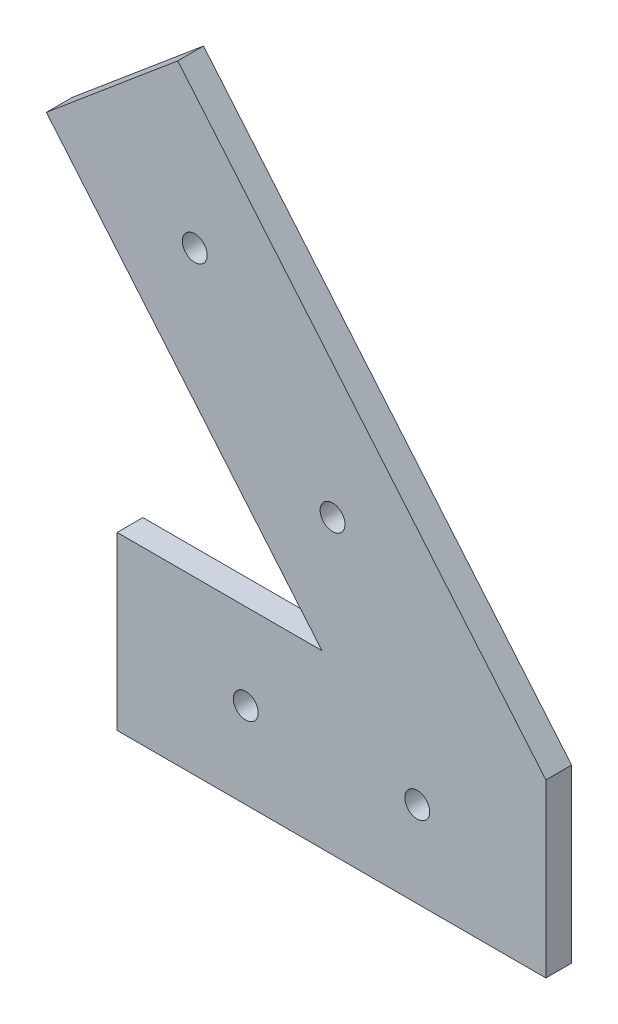
ISO-10303-21;
HEADER;
FILE_DESCRIPTION(('STEP AP214'),'2;1');
FILE_NAME('part.step','',(''),(''),'','','');
FILE_SCHEMA(('AUTOMOTIVE_DESIGN { 1 0 10303 214 1 1 1 1 }'));
ENDSEC;
DATA;
#1=APPLICATION_CONTEXT('core data for automotive mechanical design processes');
#2=APPLICATION_PROTOCOL_DEFINITION('international standard','automotive_design',2000,#1);
#3=PRODUCT_CONTEXT('',#1,'mechanical');
#4=PRODUCT('Part','Part','',(#3));
#5=PRODUCT_RELATED_PRODUCT_CATEGORY('part','',(#4));
#6=PRODUCT_DEFINITION_FORMATION('','',#4);
#7=PRODUCT_DEFINITION_CONTEXT('part definition',#1,'design');
#8=PRODUCT_DEFINITION('design','',#6,#7);
#9=PRODUCT_DEFINITION_SHAPE('','',#8);
#10=(LENGTH_UNIT() NAMED_UNIT(*) SI_UNIT(.MILLI.,.METRE.));
#11=(NAMED_UNIT(*) PLANE_ANGLE_UNIT() SI_UNIT($,.RADIAN.));
#12=(NAMED_UNIT(*) SI_UNIT($,.STERADIAN.) SOLID_ANGLE_UNIT());
#13=UNCERTAINTY_MEASURE_WITH_UNIT(LENGTH_MEASURE(1.E-05),#10,'distance_accuracy_value','');
#14=(GEOMETRIC_REPRESENTATION_CONTEXT(3) GLOBAL_UNCERTAINTY_ASSIGNED_CONTEXT((#13)) GLOBAL_UNIT_ASSIGNED_CONTEXT((#10,
#11,#12)) REPRESENTATION_CONTEXT('',''));
#15=CARTESIAN_POINT('',(0.,0.,0.));
#16=DIRECTION('',(0.,0.,1.));
#17=DIRECTION('',(1.,0.,0.));
#18=AXIS2_PLACEMENT_3D('',#15,#16,#17);
#19=CARTESIAN_POINT('',(0.,0.,3.));
#20=DIRECTION('',(0.,0.,1.));
#21=DIRECTION('',(1.,0.,0.));
#22=AXIS2_PLACEMENT_3D('',#19,#20,#21);
#23=PLANE('',#22);
#24=CARTESIAN_POINT('',(17.3022585764879,-5.0627905499192,3.));
#25=DIRECTION('',(0.,0.,1.));
#26=DIRECTION('',(1.,0.,0.));
#27=AXIS2_PLACEMENT_3D('',#24,#25,#26);
#28=CIRCLE('',#27,1.45);
#29=CARTESIAN_POINT('',(18.7522585764879,-5.0627905499192,3.));
#30=VERTEX_POINT('',#29);
#31=EDGE_CURVE('E170',#30,#30,#28,.T.);
#32=ORIENTED_EDGE('',*,*,#31,.F.);
#33=EDGE_LOOP('',(#32));
#34=FACE_BOUND('',#33,.T.);
#35=CARTESIAN_POINT('',(23.2475262709729,-48.3022221559487,3.));
#36=DIRECTION('',(0.,0.,1.));
#37=DIRECTION('',(1.,0.,0.));
#38=AXIS2_PLACEMENT_3D('',#35,#36,#37);
#39=CIRCLE('',#38,1.45);
#40=CARTESIAN_POINT('',(24.6975262709729,-48.3022221559487,3.));
#41=VERTEX_POINT('',#40);
#42=EDGE_CURVE('E128',#41,#41,#39,.T.);
#43=ORIENTED_EDGE('',*,*,#42,.F.);
#44=EDGE_LOOP('',(#43));
#45=FACE_BOUND('',#44,.T.);
#46=DIRECTION('',(-0.766044443118975,-0.642787609686543,0.));
#47=VECTOR('',#46,1.);
#48=CARTESIAN_POINT('',(0.,0.,3.));
#49=LINE('',#48,#47);
#50=CARTESIAN_POINT('',(15.3208888623795,12.8557521937308,3.));
#51=VERTEX_POINT('',#50);
#52=CARTESIAN_POINT('',(0.,0.,3.));
#53=VERTEX_POINT('',#52);
#54=EDGE_CURVE('E137',#51,#53,#49,.T.);
#55=ORIENTED_EDGE('',*,*,#54,.T.);
#56=DIRECTION('',(0.642787609686543,-0.766044443118975,0.));
#57=VECTOR('',#56,1.);
#58=CARTESIAN_POINT('',(0.,0.,3.));
#59=LINE('',#58,#57);
#60=CARTESIAN_POINT('',(32.1393804843272,-38.3022221559487,3.));
#61=VERTEX_POINT('',#60);
#62=EDGE_CURVE('E90',#53,#61,#59,.T.);
#63=ORIENTED_EDGE('',*,*,#62,.T.);
#64=DIRECTION('',(-1.,0.,0.));
#65=VECTOR('',#64,1.);
#66=CARTESIAN_POINT('',(32.1393804843272,-38.3022221559487,3.));
#67=LINE('',#66,#65);
#68=CARTESIAN_POINT('',(8.24752627097287,-38.3022221559487,3.));
#69=VERTEX_POINT('',#68);
#70=EDGE_CURVE('E149',#61,#69,#67,.T.);
#71=ORIENTED_EDGE('',*,*,#70,.T.);
#72=DIRECTION('',(0.,-1.,0.));
#73=VECTOR('',#72,1.);
#74=CARTESIAN_POINT('',(8.24752627097287,-38.3022221559487,3.));
#75=LINE('',#74,#73);
#76=CARTESIAN_POINT('',(8.24752627097287,-58.3022221559487,3.));
#77=VERTEX_POINT('',#76);
#78=EDGE_CURVE('E106',#69,#77,#75,.T.);
#79=ORIENTED_EDGE('',*,*,#78,.T.);
#80=DIRECTION('',(1.,0.,0.));
#81=VECTOR('',#80,1.);
#82=CARTESIAN_POINT('',(8.24752627097287,-58.3022221559487,3.));
#83=LINE('',#82,#81);
#84=CARTESIAN_POINT('',(58.2475262709729,-58.3022221559487,3.));
#85=VERTEX_POINT('',#84);
#86=EDGE_CURVE('E100',#77,#85,#83,.T.);
#87=ORIENTED_EDGE('',*,*,#86,.T.);
#88=DIRECTION('',(0.,1.,0.));
#89=VECTOR('',#88,1.);
#90=CARTESIAN_POINT('',(58.2475262709729,-58.3022221559487,3.));
#91=LINE('',#90,#89);
#92=CARTESIAN_POINT('',(58.2475262709729,-38.3022221559487,3.));
#93=VERTEX_POINT('',#92);
#94=EDGE_CURVE('E104',#85,#93,#91,.T.);
#95=ORIENTED_EDGE('',*,*,#94,.T.);
#96=DIRECTION('',(-0.642787609686544,0.766044443118974,0.));
#97=VECTOR('',#96,1.);
#98=CARTESIAN_POINT('',(58.2475262709729,-38.3022221559487,3.));
#99=LINE('',#98,#97);
#100=EDGE_CURVE('E50',#93,#51,#99,.T.);
#101=ORIENTED_EDGE('',*,*,#100,.T.);
#102=EDGE_LOOP('',(#55,#63,#71,#79,#87,#95,#101));
#103=FACE_BOUND('',#102,.T.);
#104=CARTESIAN_POINT('',(43.2475262709729,-48.3022221559487,3.));
#105=DIRECTION('',(0.,0.,1.));
#106=DIRECTION('',(1.,0.,0.));
#107=AXIS2_PLACEMENT_3D('',#104,#105,#106);
#108=CIRCLE('',#107,1.45);
#109=CARTESIAN_POINT('',(44.6975262709729,-48.3022221559487,3.));
#110=VERTEX_POINT('',#109);
#111=EDGE_CURVE('E164',#110,#110,#108,.T.);
#112=ORIENTED_EDGE('',*,*,#111,.F.);
#113=EDGE_LOOP('',(#112));
#114=FACE_BOUND('',#113,.T.);
#115=CARTESIAN_POINT('',(33.3719488186515,-24.2139016278936,3.));
#116=DIRECTION('',(0.,0.,1.));
#117=DIRECTION('',(1.,0.,0.));
#118=AXIS2_PLACEMENT_3D('',#115,#116,#117);
#119=CIRCLE('',#118,1.45);
#120=CARTESIAN_POINT('',(34.8219488186515,-24.2139016278936,3.));
#121=VERTEX_POINT('',#120);
#122=EDGE_CURVE('E176',#121,#121,#119,.T.);
#123=ORIENTED_EDGE('',*,*,#122,.F.);
#124=EDGE_LOOP('',(#123));
#125=FACE_BOUND('',#124,.T.);
#126=ADVANCED_FACE('F33',(#34,#45,#103,#114,#125),#23,.T.);
#127=CARTESIAN_POINT('',(0.,0.,0.));
#128=DIRECTION('',(0.,0.,1.));
#129=DIRECTION('',(1.,0.,0.));
#130=AXIS2_PLACEMENT_3D('',#127,#128,#129);
#131=PLANE('',#130);
#132=DIRECTION('',(-0.766044443118975,-0.642787609686543,0.));
#133=VECTOR('',#132,1.);
#134=CARTESIAN_POINT('',(0.,0.,0.));
#135=LINE('',#134,#133);
#136=CARTESIAN_POINT('',(15.3208888623795,12.8557521937308,0.));
#137=VERTEX_POINT('',#136);
#138=CARTESIAN_POINT('',(0.,0.,0.));
#139=VERTEX_POINT('',#138);
#140=EDGE_CURVE('E124',#137,#139,#135,.T.);
#141=ORIENTED_EDGE('',*,*,#140,.F.);
#142=DIRECTION('',(-0.642787609686544,0.766044443118974,0.));
#143=VECTOR('',#142,1.);
#144=CARTESIAN_POINT('',(58.2475262709729,-38.3022221559487,0.));
#145=LINE('',#144,#143);
#146=CARTESIAN_POINT('',(58.2475262709729,-38.3022221559487,0.));
#147=VERTEX_POINT('',#146);
#148=EDGE_CURVE('E82',#147,#137,#145,.T.);
#149=ORIENTED_EDGE('',*,*,#148,.F.);
#150=DIRECTION('',(0.,1.,0.));
#151=VECTOR('',#150,1.);
#152=CARTESIAN_POINT('',(58.2475262709729,-58.3022221559487,0.));
#153=LINE('',#152,#151);
#154=CARTESIAN_POINT('',(58.2475262709729,-58.3022221559487,0.));
#155=VERTEX_POINT('',#154);
#156=EDGE_CURVE('E76',#155,#147,#153,.T.);
#157=ORIENTED_EDGE('',*,*,#156,.F.);
#158=DIRECTION('',(1.,0.,0.));
#159=VECTOR('',#158,1.);
#160=CARTESIAN_POINT('',(8.24752627097287,-58.3022221559487,0.));
#161=LINE('',#160,#159);
#162=CARTESIAN_POINT('',(8.24752627097287,-58.3022221559487,0.));
#163=VERTEX_POINT('',#162);
#164=EDGE_CURVE('E114',#163,#155,#161,.T.);
#165=ORIENTED_EDGE('',*,*,#164,.F.);
#166=DIRECTION('',(0.,-1.,0.));
#167=VECTOR('',#166,1.);
#168=CARTESIAN_POINT('',(8.24752627097287,-38.3022221559487,0.));
#169=LINE('',#168,#167);
#170=CARTESIAN_POINT('',(8.24752627097287,-38.3022221559487,0.));
#171=VERTEX_POINT('',#170);
#172=EDGE_CURVE('E132',#171,#163,#169,.T.);
#173=ORIENTED_EDGE('',*,*,#172,.F.);
#174=DIRECTION('',(-1.,0.,0.));
#175=VECTOR('',#174,1.);
#176=CARTESIAN_POINT('',(32.1393804843272,-38.3022221559487,0.));
#177=LINE('',#176,#175);
#178=CARTESIAN_POINT('',(32.1393804843272,-38.3022221559487,0.));
#179=VERTEX_POINT('',#178);
#180=EDGE_CURVE('E130',#179,#171,#177,.T.);
#181=ORIENTED_EDGE('',*,*,#180,.F.);
#182=DIRECTION('',(0.642787609686543,-0.766044443118975,0.));
#183=VECTOR('',#182,1.);
#184=CARTESIAN_POINT('',(0.,0.,0.));
#185=LINE('',#184,#183);
#186=EDGE_CURVE('E127',#139,#179,#185,.T.);
#187=ORIENTED_EDGE('',*,*,#186,.F.);
#188=EDGE_LOOP('',(#141,#149,#157,#165,#173,#181,#187));
#189=FACE_BOUND('',#188,.T.);
#190=CARTESIAN_POINT('',(23.2475262709729,-48.3022221559487,0.));
#191=DIRECTION('',(0.,0.,1.));
#192=DIRECTION('',(1.,0.,0.));
#193=AXIS2_PLACEMENT_3D('',#190,#191,#192);
#194=CIRCLE('',#193,1.45);
#195=CARTESIAN_POINT('',(24.6975262709729,-48.3022221559487,0.));
#196=VERTEX_POINT('',#195);
#197=EDGE_CURVE('E161',#196,#196,#194,.T.);
#198=ORIENTED_EDGE('',*,*,#197,.T.);
#199=EDGE_LOOP('',(#198));
#200=FACE_BOUND('',#199,.T.);
#201=CARTESIAN_POINT('',(43.2475262709729,-48.3022221559487,0.));
#202=DIRECTION('',(0.,0.,1.));
#203=DIRECTION('',(1.,0.,0.));
#204=AXIS2_PLACEMENT_3D('',#201,#202,#203);
#205=CIRCLE('',#204,1.45);
#206=CARTESIAN_POINT('',(44.6975262709729,-48.3022221559487,0.));
#207=VERTEX_POINT('',#206);
#208=EDGE_CURVE('E167',#207,#207,#205,.T.);
#209=ORIENTED_EDGE('',*,*,#208,.T.);
#210=EDGE_LOOP('',(#209));
#211=FACE_BOUND('',#210,.T.);
#212=CARTESIAN_POINT('',(17.3022585764879,-5.0627905499192,0.));
#213=DIRECTION('',(0.,0.,1.));
#214=DIRECTION('',(1.,0.,0.));
#215=AXIS2_PLACEMENT_3D('',#212,#213,#214);
#216=CIRCLE('',#215,1.45);
#217=CARTESIAN_POINT('',(18.7522585764879,-5.0627905499192,0.));
#218=VERTEX_POINT('',#217);
#219=EDGE_CURVE('E173',#218,#218,#216,.T.);
#220=ORIENTED_EDGE('',*,*,#219,.T.);
#221=EDGE_LOOP('',(#220));
#222=FACE_BOUND('',#221,.T.);
#223=CARTESIAN_POINT('',(33.3719488186515,-24.2139016278936,0.));
#224=DIRECTION('',(0.,0.,1.));
#225=DIRECTION('',(1.,0.,0.));
#226=AXIS2_PLACEMENT_3D('',#223,#224,#225);
#227=CIRCLE('',#226,1.45);
#228=CARTESIAN_POINT('',(34.8219488186515,-24.2139016278936,0.));
#229=VERTEX_POINT('',#228);
#230=EDGE_CURVE('E179',#229,#229,#227,.T.);
#231=ORIENTED_EDGE('',*,*,#230,.T.);
#232=EDGE_LOOP('',(#231));
#233=FACE_BOUND('',#232,.T.);
#234=ADVANCED_FACE('F153',(#189,#200,#211,#222,#233),#131,.F.);
#235=CARTESIAN_POINT('',(0.,0.,3.));
#236=DIRECTION('',(0.642787609686543,-0.766044443118975,0.));
#237=DIRECTION('',(0.766044443118975,0.642787609686543,0.));
#238=AXIS2_PLACEMENT_3D('',#235,#236,#237);
#239=PLANE('',#238);
#240=ORIENTED_EDGE('',*,*,#140,.T.);
#241=DIRECTION('',(0.,0.,-1.));
#242=VECTOR('',#241,1.);
#243=CARTESIAN_POINT('',(0.,0.,3.));
#244=LINE('',#243,#242);
#245=EDGE_CURVE('E11',#53,#139,#244,.T.);
#246=ORIENTED_EDGE('',*,*,#245,.F.);
#247=ORIENTED_EDGE('',*,*,#54,.F.);
#248=DIRECTION('',(0.,0.,-1.));
#249=VECTOR('',#248,1.);
#250=CARTESIAN_POINT('',(15.3208888623795,12.8557521937308,3.));
#251=LINE('',#250,#249);
#252=EDGE_CURVE('E120',#51,#137,#251,.T.);
#253=ORIENTED_EDGE('',*,*,#252,.T.);
#254=EDGE_LOOP('',(#240,#246,#247,#253));
#255=FACE_BOUND('',#254,.T.);
#256=ADVANCED_FACE('F35',(#255),#239,.F.);
#257=CARTESIAN_POINT('',(0.,0.,3.));
#258=DIRECTION('',(0.766044443118975,0.642787609686543,0.));
#259=DIRECTION('',(-0.642787609686543,0.766044443118975,0.));
#260=AXIS2_PLACEMENT_3D('',#257,#258,#259);
#261=PLANE('',#260);
#262=ORIENTED_EDGE('',*,*,#186,.T.);
#263=DIRECTION('',(0.,0.,-1.));
#264=VECTOR('',#263,1.);
#265=CARTESIAN_POINT('',(32.1393804843272,-38.3022221559487,3.));
#266=LINE('',#265,#264);
#267=EDGE_CURVE('E42',#61,#179,#266,.T.);
#268=ORIENTED_EDGE('',*,*,#267,.F.);
#269=ORIENTED_EDGE('',*,*,#62,.F.);
#270=ORIENTED_EDGE('',*,*,#245,.T.);
#271=EDGE_LOOP('',(#262,#268,#269,#270));
#272=FACE_BOUND('',#271,.T.);
#273=ADVANCED_FACE('F211',(#272),#261,.F.);
#274=CARTESIAN_POINT('',(32.1393804843272,-38.3022221559487,3.));
#275=DIRECTION('',(0.,-1.,0.));
#276=DIRECTION('',(1.,0.,0.));
#277=AXIS2_PLACEMENT_3D('',#274,#275,#276);
#278=PLANE('',#277);
#279=ORIENTED_EDGE('',*,*,#180,.T.);
#280=DIRECTION('',(0.,0.,-1.));
#281=VECTOR('',#280,1.);
#282=CARTESIAN_POINT('',(8.24752627097287,-38.3022221559487,3.));
#283=LINE('',#282,#281);
#284=EDGE_CURVE('E141',#69,#171,#283,.T.);
#285=ORIENTED_EDGE('',*,*,#284,.F.);
#286=ORIENTED_EDGE('',*,*,#70,.F.);
#287=ORIENTED_EDGE('',*,*,#267,.T.);
#288=EDGE_LOOP('',(#279,#285,#286,#287));
#289=FACE_BOUND('',#288,.T.);
#290=ADVANCED_FACE('F147',(#289),#278,.F.);
#291=CARTESIAN_POINT('',(8.24752627097287,-38.3022221559487,3.));
#292=DIRECTION('',(1.,0.,0.));
#293=DIRECTION('',(0.,1.,0.));
#294=AXIS2_PLACEMENT_3D('',#291,#292,#293);
#295=PLANE('',#294);
#296=ORIENTED_EDGE('',*,*,#172,.T.);
#297=DIRECTION('',(0.,0.,-1.));
#298=VECTOR('',#297,1.);
#299=CARTESIAN_POINT('',(8.24752627097287,-58.3022221559487,3.));
#300=LINE('',#299,#298);
#301=EDGE_CURVE('E115',#77,#163,#300,.T.);
#302=ORIENTED_EDGE('',*,*,#301,.F.);
#303=ORIENTED_EDGE('',*,*,#78,.F.);
#304=ORIENTED_EDGE('',*,*,#284,.T.);
#305=EDGE_LOOP('',(#296,#302,#303,#304));
#306=FACE_BOUND('',#305,.T.);
#307=ADVANCED_FACE('F156',(#306),#295,.F.);
#308=CARTESIAN_POINT('',(8.24752627097287,-58.3022221559487,3.));
#309=DIRECTION('',(0.,1.,0.));
#310=DIRECTION('',(0.,0.,1.));
#311=AXIS2_PLACEMENT_3D('',#308,#309,#310);
#312=PLANE('',#311);
#313=ORIENTED_EDGE('',*,*,#164,.T.);
#314=DIRECTION('',(0.,0.,-1.));
#315=VECTOR('',#314,1.);
#316=CARTESIAN_POINT('',(58.2475262709729,-58.3022221559487,3.));
#317=LINE('',#316,#315);
#318=EDGE_CURVE('E111',#85,#155,#317,.T.);
#319=ORIENTED_EDGE('',*,*,#318,.F.);
#320=ORIENTED_EDGE('',*,*,#86,.F.);
#321=ORIENTED_EDGE('',*,*,#301,.T.);
#322=EDGE_LOOP('',(#313,#319,#320,#321));
#323=FACE_BOUND('',#322,.T.);
#324=ADVANCED_FACE('F112',(#323),#312,.F.);
#325=CARTESIAN_POINT('',(58.2475262709729,-58.3022221559487,3.));
#326=DIRECTION('',(-1.,0.,0.));
#327=DIRECTION('',(0.,-1.,0.));
#328=AXIS2_PLACEMENT_3D('',#325,#326,#327);
#329=PLANE('',#328);
#330=ORIENTED_EDGE('',*,*,#156,.T.);
#331=DIRECTION('',(0.,0.,-1.));
#332=VECTOR('',#331,1.);
#333=CARTESIAN_POINT('',(58.2475262709729,-38.3022221559487,3.));
#334=LINE('',#333,#332);
#335=EDGE_CURVE('E116',#93,#147,#334,.T.);
#336=ORIENTED_EDGE('',*,*,#335,.F.);
#337=ORIENTED_EDGE('',*,*,#94,.F.);
#338=ORIENTED_EDGE('',*,*,#318,.T.);
#339=EDGE_LOOP('',(#330,#336,#337,#338));
#340=FACE_BOUND('',#339,.T.);
#341=ADVANCED_FACE('F118',(#340),#329,.F.);
#342=CARTESIAN_POINT('',(58.2475262709729,-38.3022221559487,3.));
#343=DIRECTION('',(-0.766044443118974,-0.642787609686544,0.));
#344=DIRECTION('',(0.642787609686544,-0.766044443118974,0.));
#345=AXIS2_PLACEMENT_3D('',#342,#343,#344);
#346=PLANE('',#345);
#347=ORIENTED_EDGE('',*,*,#148,.T.);
#348=ORIENTED_EDGE('',*,*,#252,.F.);
#349=ORIENTED_EDGE('',*,*,#100,.F.);
#350=ORIENTED_EDGE('',*,*,#335,.T.);
#351=EDGE_LOOP('',(#347,#348,#349,#350));
#352=FACE_BOUND('',#351,.T.);
#353=ADVANCED_FACE('F201',(#352),#346,.F.);
#354=CARTESIAN_POINT('',(23.2475262709729,-48.3022221559487,3.));
#355=DIRECTION('',(0.,0.,-1.));
#356=DIRECTION('',(-1.,0.,0.));
#357=AXIS2_PLACEMENT_3D('',#354,#355,#356);
#358=CYLINDRICAL_SURFACE('',#357,1.45);
#359=ORIENTED_EDGE('',*,*,#42,.T.);
#360=EDGE_LOOP('',(#359));
#361=FACE_BOUND('',#360,.T.);
#362=ORIENTED_EDGE('',*,*,#197,.F.);
#363=EDGE_LOOP('',(#362));
#364=FACE_BOUND('',#363,.T.);
#365=ADVANCED_FACE('F198',(#361,#364),#358,.F.);
#366=CARTESIAN_POINT('',(43.2475262709729,-48.3022221559487,3.));
#367=DIRECTION('',(0.,0.,-1.));
#368=DIRECTION('',(-1.,0.,0.));
#369=AXIS2_PLACEMENT_3D('',#366,#367,#368);
#370=CYLINDRICAL_SURFACE('',#369,1.45);
#371=ORIENTED_EDGE('',*,*,#111,.T.);
#372=EDGE_LOOP('',(#371));
#373=FACE_BOUND('',#372,.T.);
#374=ORIENTED_EDGE('',*,*,#208,.F.);
#375=EDGE_LOOP('',(#374));
#376=FACE_BOUND('',#375,.T.);
#377=ADVANCED_FACE('F270',(#373,#376),#370,.F.);
#378=CARTESIAN_POINT('',(17.3022585764879,-5.0627905499192,3.));
#379=DIRECTION('',(0.,0.,-1.));
#380=DIRECTION('',(-1.,0.,0.));
#381=AXIS2_PLACEMENT_3D('',#378,#379,#380);
#382=CYLINDRICAL_SURFACE('',#381,1.45);
#383=ORIENTED_EDGE('',*,*,#31,.T.);
#384=EDGE_LOOP('',(#383));
#385=FACE_BOUND('',#384,.T.);
#386=ORIENTED_EDGE('',*,*,#219,.F.);
#387=EDGE_LOOP('',(#386));
#388=FACE_BOUND('',#387,.T.);
#389=ADVANCED_FACE('F278',(#385,#388),#382,.F.);
#390=CARTESIAN_POINT('',(33.3719488186515,-24.2139016278936,3.));
#391=DIRECTION('',(0.,0.,-1.));
#392=DIRECTION('',(-1.,0.,0.));
#393=AXIS2_PLACEMENT_3D('',#390,#391,#392);
#394=CYLINDRICAL_SURFACE('',#393,1.45);
#395=ORIENTED_EDGE('',*,*,#122,.T.);
#396=EDGE_LOOP('',(#395));
#397=FACE_BOUND('',#396,.T.);
#398=ORIENTED_EDGE('',*,*,#230,.F.);
#399=EDGE_LOOP('',(#398));
#400=FACE_BOUND('',#399,.T.);
#401=ADVANCED_FACE('F185',(#397,#400),#394,.F.);
#402=CLOSED_SHELL('',(#126,#234,#256,#273,#290,#307,#324,#341,#353,#365,#377,#389,#401));
#403=MANIFOLD_SOLID_BREP('B2',#402);
#404=ADVANCED_BREP_SHAPE_REPRESENTATION('',(#18,#403),#14);
#405=SHAPE_DEFINITION_REPRESENTATION(#9,#404);
ENDSEC;
END-ISO-10303-21;
